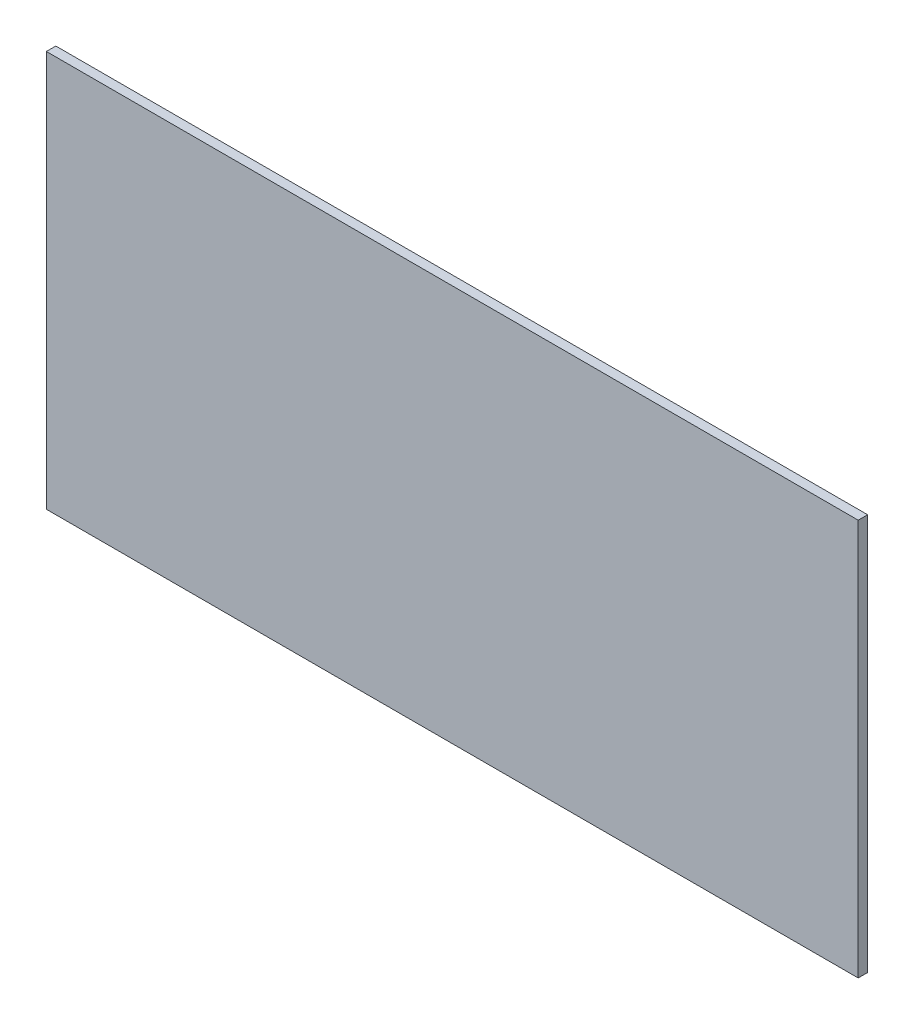
ISO-10303-21;
HEADER;
FILE_DESCRIPTION(('STEP AP214'),'2;1');
FILE_NAME('part.step','',(''),(''),'','','');
FILE_SCHEMA(('AUTOMOTIVE_DESIGN { 1 0 10303 214 1 1 1 1 }'));
ENDSEC;
DATA;
#1=APPLICATION_CONTEXT('core data for automotive mechanical design processes');
#2=APPLICATION_PROTOCOL_DEFINITION('international standard','automotive_design',2000,#1);
#3=PRODUCT_CONTEXT('',#1,'mechanical');
#4=PRODUCT('Part','Part','',(#3));
#5=PRODUCT_RELATED_PRODUCT_CATEGORY('part','',(#4));
#6=PRODUCT_DEFINITION_FORMATION('','',#4);
#7=PRODUCT_DEFINITION_CONTEXT('part definition',#1,'design');
#8=PRODUCT_DEFINITION('design','',#6,#7);
#9=PRODUCT_DEFINITION_SHAPE('','',#8);
#10=(LENGTH_UNIT() NAMED_UNIT(*) SI_UNIT(.MILLI.,.METRE.));
#11=(NAMED_UNIT(*) PLANE_ANGLE_UNIT() SI_UNIT($,.RADIAN.));
#12=(NAMED_UNIT(*) SI_UNIT($,.STERADIAN.) SOLID_ANGLE_UNIT());
#13=UNCERTAINTY_MEASURE_WITH_UNIT(LENGTH_MEASURE(1.E-05),#10,'distance_accuracy_value','');
#14=(GEOMETRIC_REPRESENTATION_CONTEXT(3) GLOBAL_UNCERTAINTY_ASSIGNED_CONTEXT((#13)) GLOBAL_UNIT_ASSIGNED_CONTEXT((#10,
#11,#12)) REPRESENTATION_CONTEXT('',''));
#15=CARTESIAN_POINT('',(0.,0.,0.));
#16=DIRECTION('',(0.,0.,1.));
#17=DIRECTION('',(1.,0.,0.));
#18=AXIS2_PLACEMENT_3D('',#15,#16,#17);
#19=CARTESIAN_POINT('',(0.,0.,4.7625));
#20=DIRECTION('',(1.,0.,0.));
#21=DIRECTION('',(0.,0.,-1.));
#22=AXIS2_PLACEMENT_3D('',#19,#20,#21);
#23=PLANE('',#22);
#24=DIRECTION('',(0.,-1.,0.));
#25=VECTOR('',#24,1.);
#26=CARTESIAN_POINT('',(0.,0.,0.));
#27=LINE('',#26,#25);
#28=CARTESIAN_POINT('',(0.,200.,0.));
#29=VERTEX_POINT('',#28);
#30=CARTESIAN_POINT('',(0.,0.,0.));
#31=VERTEX_POINT('',#30);
#32=EDGE_CURVE('E97',#29,#31,#27,.T.);
#33=ORIENTED_EDGE('',*,*,#32,.T.);
#34=DIRECTION('',(0.,0.,-1.));
#35=VECTOR('',#34,1.);
#36=CARTESIAN_POINT('',(0.,0.,4.7625));
#37=LINE('',#36,#35);
#38=CARTESIAN_POINT('',(0.,0.,4.7625));
#39=VERTEX_POINT('',#38);
#40=EDGE_CURVE('E11',#39,#31,#37,.T.);
#41=ORIENTED_EDGE('',*,*,#40,.F.);
#42=DIRECTION('',(0.,-1.,0.));
#43=VECTOR('',#42,1.);
#44=CARTESIAN_POINT('',(0.,0.,4.7625));
#45=LINE('',#44,#43);
#46=CARTESIAN_POINT('',(0.,200.,4.7625));
#47=VERTEX_POINT('',#46);
#48=EDGE_CURVE('E85',#47,#39,#45,.T.);
#49=ORIENTED_EDGE('',*,*,#48,.F.);
#50=DIRECTION('',(0.,0.,-1.));
#51=VECTOR('',#50,1.);
#52=CARTESIAN_POINT('',(0.,200.,4.7625));
#53=LINE('',#52,#51);
#54=EDGE_CURVE('E93',#47,#29,#53,.T.);
#55=ORIENTED_EDGE('',*,*,#54,.T.);
#56=EDGE_LOOP('',(#33,#41,#49,#55));
#57=FACE_BOUND('',#56,.T.);
#58=ADVANCED_FACE('F34',(#57),#23,.F.);
#59=CARTESIAN_POINT('',(0.,0.,4.7625));
#60=DIRECTION('',(0.,1.,0.));
#61=DIRECTION('',(0.,0.,1.));
#62=AXIS2_PLACEMENT_3D('',#59,#60,#61);
#63=PLANE('',#62);
#64=DIRECTION('',(1.,0.,0.));
#65=VECTOR('',#64,1.);
#66=CARTESIAN_POINT('',(0.,0.,0.));
#67=LINE('',#66,#65);
#68=CARTESIAN_POINT('',(409.525,0.,0.));
#69=VERTEX_POINT('',#68);
#70=EDGE_CURVE('E89',#31,#69,#67,.T.);
#71=ORIENTED_EDGE('',*,*,#70,.T.);
#72=DIRECTION('',(0.,0.,-1.));
#73=VECTOR('',#72,1.);
#74=CARTESIAN_POINT('',(409.525,0.,4.7625));
#75=LINE('',#74,#73);
#76=CARTESIAN_POINT('',(409.525,0.,4.7625));
#77=VERTEX_POINT('',#76);
#78=EDGE_CURVE('E42',#77,#69,#75,.T.);
#79=ORIENTED_EDGE('',*,*,#78,.F.);
#80=DIRECTION('',(1.,0.,0.));
#81=VECTOR('',#80,1.);
#82=CARTESIAN_POINT('',(0.,0.,4.7625));
#83=LINE('',#82,#81);
#84=EDGE_CURVE('E80',#39,#77,#83,.T.);
#85=ORIENTED_EDGE('',*,*,#84,.F.);
#86=ORIENTED_EDGE('',*,*,#40,.T.);
#87=EDGE_LOOP('',(#71,#79,#85,#86));
#88=FACE_BOUND('',#87,.T.);
#89=ADVANCED_FACE('F88',(#88),#63,.F.);
#90=CARTESIAN_POINT('',(409.525,0.,4.7625));
#91=DIRECTION('',(-1.,0.,0.));
#92=DIRECTION('',(0.,0.,1.));
#93=AXIS2_PLACEMENT_3D('',#90,#91,#92);
#94=PLANE('',#93);
#95=DIRECTION('',(0.,1.,0.));
#96=VECTOR('',#95,1.);
#97=CARTESIAN_POINT('',(409.525,0.,0.));
#98=LINE('',#97,#96);
#99=CARTESIAN_POINT('',(409.525,200.,0.));
#100=VERTEX_POINT('',#99);
#101=EDGE_CURVE('E67',#69,#100,#98,.T.);
#102=ORIENTED_EDGE('',*,*,#101,.T.);
#103=DIRECTION('',(0.,0.,-1.));
#104=VECTOR('',#103,1.);
#105=CARTESIAN_POINT('',(409.525,200.,4.7625));
#106=LINE('',#105,#104);
#107=CARTESIAN_POINT('',(409.525,200.,4.7625));
#108=VERTEX_POINT('',#107);
#109=EDGE_CURVE('E90',#108,#100,#106,.T.);
#110=ORIENTED_EDGE('',*,*,#109,.F.);
#111=DIRECTION('',(0.,1.,0.));
#112=VECTOR('',#111,1.);
#113=CARTESIAN_POINT('',(409.525,0.,4.7625));
#114=LINE('',#113,#112);
#115=EDGE_CURVE('E83',#77,#108,#114,.T.);
#116=ORIENTED_EDGE('',*,*,#115,.F.);
#117=ORIENTED_EDGE('',*,*,#78,.T.);
#118=EDGE_LOOP('',(#102,#110,#116,#117));
#119=FACE_BOUND('',#118,.T.);
#120=ADVANCED_FACE('F91',(#119),#94,.F.);
#121=CARTESIAN_POINT('',(0.,200.,4.7625));
#122=DIRECTION('',(0.,-1.,0.));
#123=DIRECTION('',(0.,0.,-1.));
#124=AXIS2_PLACEMENT_3D('',#121,#122,#123);
#125=PLANE('',#124);
#126=DIRECTION('',(-1.,0.,0.));
#127=VECTOR('',#126,1.);
#128=CARTESIAN_POINT('',(0.,200.,0.));
#129=LINE('',#128,#127);
#130=EDGE_CURVE('E73',#100,#29,#129,.T.);
#131=ORIENTED_EDGE('',*,*,#130,.T.);
#132=ORIENTED_EDGE('',*,*,#54,.F.);
#133=DIRECTION('',(-1.,0.,0.));
#134=VECTOR('',#133,1.);
#135=CARTESIAN_POINT('',(0.,200.,4.7625));
#136=LINE('',#135,#134);
#137=EDGE_CURVE('E50',#108,#47,#136,.T.);
#138=ORIENTED_EDGE('',*,*,#137,.F.);
#139=ORIENTED_EDGE('',*,*,#109,.T.);
#140=EDGE_LOOP('',(#131,#132,#138,#139));
#141=FACE_BOUND('',#140,.T.);
#142=ADVANCED_FACE('F104',(#141),#125,.F.);
#143=CARTESIAN_POINT('',(0.,0.,4.7625));
#144=DIRECTION('',(0.,0.,-1.));
#145=DIRECTION('',(-1.,0.,0.));
#146=AXIS2_PLACEMENT_3D('',#143,#144,#145);
#147=PLANE('',#146);
#148=ORIENTED_EDGE('',*,*,#48,.T.);
#149=ORIENTED_EDGE('',*,*,#84,.T.);
#150=ORIENTED_EDGE('',*,*,#115,.T.);
#151=ORIENTED_EDGE('',*,*,#137,.T.);
#152=EDGE_LOOP('',(#148,#149,#150,#151));
#153=FACE_BOUND('',#152,.T.);
#154=ADVANCED_FACE('F81',(#153),#147,.F.);
#155=CARTESIAN_POINT('',(0.,0.,0.));
#156=DIRECTION('',(0.,0.,-1.));
#157=DIRECTION('',(-1.,0.,0.));
#158=AXIS2_PLACEMENT_3D('',#155,#156,#157);
#159=PLANE('',#158);
#160=ORIENTED_EDGE('',*,*,#32,.F.);
#161=ORIENTED_EDGE('',*,*,#130,.F.);
#162=ORIENTED_EDGE('',*,*,#101,.F.);
#163=ORIENTED_EDGE('',*,*,#70,.F.);
#164=EDGE_LOOP('',(#160,#161,#162,#163));
#165=FACE_BOUND('',#164,.T.);
#166=ADVANCED_FACE('F107',(#165),#159,.T.);
#167=CLOSED_SHELL('',(#58,#89,#120,#142,#154,#166));
#168=MANIFOLD_SOLID_BREP('B2',#167);
#169=ADVANCED_BREP_SHAPE_REPRESENTATION('',(#18,#168),#14);
#170=SHAPE_DEFINITION_REPRESENTATION(#9,#169);
ENDSEC;
END-ISO-10303-21;
